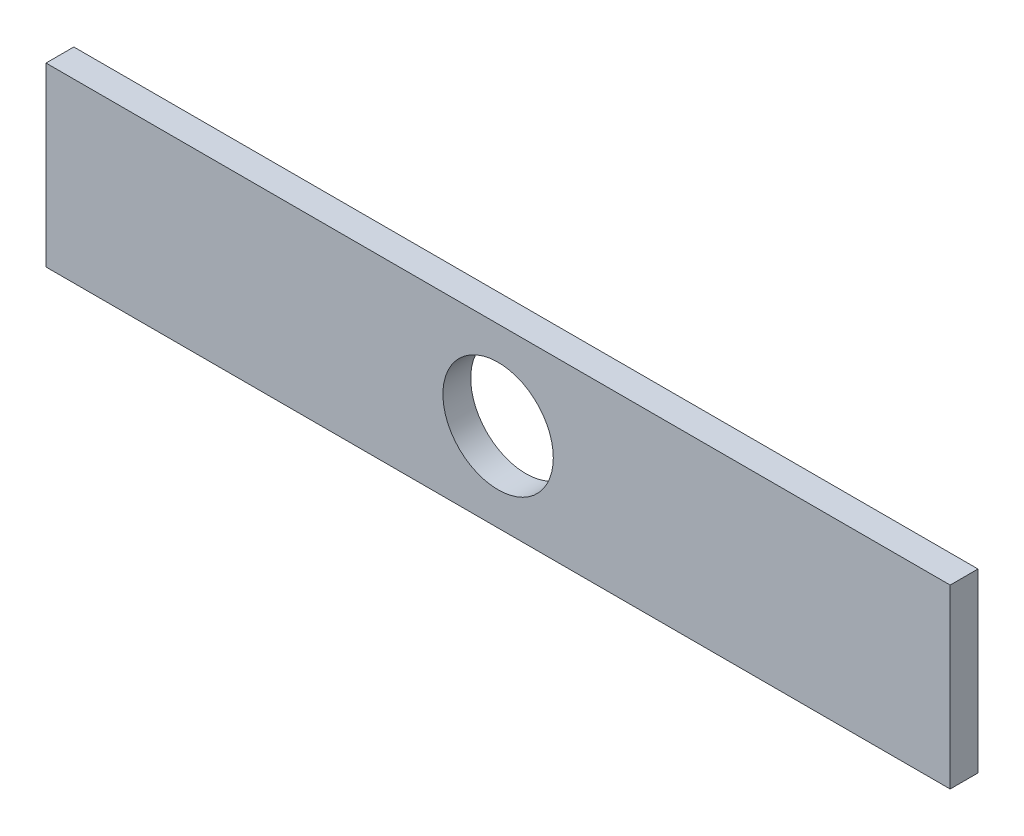
ISO-10303-21;
HEADER;
FILE_DESCRIPTION(('STEP AP214'),'2;1');
FILE_NAME('part.step','',(''),(''),'','','');
FILE_SCHEMA(('AUTOMOTIVE_DESIGN { 1 0 10303 214 1 1 1 1 }'));
ENDSEC;
DATA;
#1=APPLICATION_CONTEXT('core data for automotive mechanical design processes');
#2=APPLICATION_PROTOCOL_DEFINITION('international standard','automotive_design',2000,#1);
#3=PRODUCT_CONTEXT('',#1,'mechanical');
#4=PRODUCT('Part','Part','',(#3));
#5=PRODUCT_RELATED_PRODUCT_CATEGORY('part','',(#4));
#6=PRODUCT_DEFINITION_FORMATION('','',#4);
#7=PRODUCT_DEFINITION_CONTEXT('part definition',#1,'design');
#8=PRODUCT_DEFINITION('design','',#6,#7);
#9=PRODUCT_DEFINITION_SHAPE('','',#8);
#10=(LENGTH_UNIT() NAMED_UNIT(*) SI_UNIT(.MILLI.,.METRE.));
#11=(NAMED_UNIT(*) PLANE_ANGLE_UNIT() SI_UNIT($,.RADIAN.));
#12=(NAMED_UNIT(*) SI_UNIT($,.STERADIAN.) SOLID_ANGLE_UNIT());
#13=UNCERTAINTY_MEASURE_WITH_UNIT(LENGTH_MEASURE(1.E-05),#10,'distance_accuracy_value','');
#14=(GEOMETRIC_REPRESENTATION_CONTEXT(3) GLOBAL_UNCERTAINTY_ASSIGNED_CONTEXT((#13)) GLOBAL_UNIT_ASSIGNED_CONTEXT((#10,
#11,#12)) REPRESENTATION_CONTEXT('',''));
#15=CARTESIAN_POINT('',(0.,0.,0.));
#16=DIRECTION('',(0.,0.,1.));
#17=DIRECTION('',(1.,0.,0.));
#18=AXIS2_PLACEMENT_3D('',#15,#16,#17);
#19=CARTESIAN_POINT('',(0.,0.,4.));
#20=DIRECTION('',(0.,0.,1.));
#21=DIRECTION('',(1.,0.,0.));
#22=AXIS2_PLACEMENT_3D('',#19,#20,#21);
#23=PLANE('',#22);
#24=DIRECTION('',(0.,-1.,0.));
#25=VECTOR('',#24,1.);
#26=CARTESIAN_POINT('',(-65.,-12.7,4.));
#27=LINE('',#26,#25);
#28=CARTESIAN_POINT('',(-65.,12.7,4.));
#29=VERTEX_POINT('',#28);
#30=CARTESIAN_POINT('',(-65.,-12.7,4.));
#31=VERTEX_POINT('',#30);
#32=EDGE_CURVE('E85',#29,#31,#27,.T.);
#33=ORIENTED_EDGE('',*,*,#32,.T.);
#34=DIRECTION('',(1.,0.,0.));
#35=VECTOR('',#34,1.);
#36=CARTESIAN_POINT('',(65.,-12.7,4.));
#37=LINE('',#36,#35);
#38=CARTESIAN_POINT('',(65.,-12.7,4.));
#39=VERTEX_POINT('',#38);
#40=EDGE_CURVE('E80',#31,#39,#37,.T.);
#41=ORIENTED_EDGE('',*,*,#40,.T.);
#42=DIRECTION('',(0.,1.,0.));
#43=VECTOR('',#42,1.);
#44=CARTESIAN_POINT('',(65.,-12.7,4.));
#45=LINE('',#44,#43);
#46=CARTESIAN_POINT('',(65.,12.7,4.));
#47=VERTEX_POINT('',#46);
#48=EDGE_CURVE('E83',#39,#47,#45,.T.);
#49=ORIENTED_EDGE('',*,*,#48,.T.);
#50=DIRECTION('',(-1.,0.,0.));
#51=VECTOR('',#50,1.);
#52=CARTESIAN_POINT('',(65.,12.7,4.));
#53=LINE('',#52,#51);
#54=EDGE_CURVE('E50',#47,#29,#53,.T.);
#55=ORIENTED_EDGE('',*,*,#54,.T.);
#56=EDGE_LOOP('',(#33,#41,#49,#55));
#57=FACE_BOUND('',#56,.T.);
#58=CARTESIAN_POINT('',(0.,0.,4.));
#59=DIRECTION('',(0.,0.,1.));
#60=DIRECTION('',(1.,0.,0.));
#61=AXIS2_PLACEMENT_3D('',#58,#59,#60);
#62=CIRCLE('',#61,7.9375);
#63=CARTESIAN_POINT('',(7.9375,0.,4.));
#64=VERTEX_POINT('',#63);
#65=EDGE_CURVE('E100',#64,#64,#62,.T.);
#66=ORIENTED_EDGE('',*,*,#65,.F.);
#67=EDGE_LOOP('',(#66));
#68=FACE_BOUND('',#67,.T.);
#69=ADVANCED_FACE('F33',(#57,#68),#23,.T.);
#70=CARTESIAN_POINT('',(0.,0.,0.));
#71=DIRECTION('',(0.,0.,1.));
#72=DIRECTION('',(1.,0.,0.));
#73=AXIS2_PLACEMENT_3D('',#70,#71,#72);
#74=PLANE('',#73);
#75=DIRECTION('',(0.,-1.,0.));
#76=VECTOR('',#75,1.);
#77=CARTESIAN_POINT('',(-65.,-12.7,0.));
#78=LINE('',#77,#76);
#79=CARTESIAN_POINT('',(-65.,12.7,0.));
#80=VERTEX_POINT('',#79);
#81=CARTESIAN_POINT('',(-65.,-12.7,0.));
#82=VERTEX_POINT('',#81);
#83=EDGE_CURVE('E97',#80,#82,#78,.T.);
#84=ORIENTED_EDGE('',*,*,#83,.F.);
#85=DIRECTION('',(-1.,0.,0.));
#86=VECTOR('',#85,1.);
#87=CARTESIAN_POINT('',(65.,12.7,0.));
#88=LINE('',#87,#86);
#89=CARTESIAN_POINT('',(65.,12.7,0.));
#90=VERTEX_POINT('',#89);
#91=EDGE_CURVE('E73',#90,#80,#88,.T.);
#92=ORIENTED_EDGE('',*,*,#91,.F.);
#93=DIRECTION('',(0.,1.,0.));
#94=VECTOR('',#93,1.);
#95=CARTESIAN_POINT('',(65.,-12.7,0.));
#96=LINE('',#95,#94);
#97=CARTESIAN_POINT('',(65.,-12.7,0.));
#98=VERTEX_POINT('',#97);
#99=EDGE_CURVE('E67',#98,#90,#96,.T.);
#100=ORIENTED_EDGE('',*,*,#99,.F.);
#101=DIRECTION('',(1.,0.,0.));
#102=VECTOR('',#101,1.);
#103=CARTESIAN_POINT('',(65.,-12.7,0.));
#104=LINE('',#103,#102);
#105=EDGE_CURVE('E89',#82,#98,#104,.T.);
#106=ORIENTED_EDGE('',*,*,#105,.F.);
#107=EDGE_LOOP('',(#84,#92,#100,#106));
#108=FACE_BOUND('',#107,.T.);
#109=CARTESIAN_POINT('',(0.,0.,0.));
#110=DIRECTION('',(0.,0.,1.));
#111=DIRECTION('',(1.,0.,0.));
#112=AXIS2_PLACEMENT_3D('',#109,#110,#111);
#113=CIRCLE('',#112,7.9375);
#114=CARTESIAN_POINT('',(7.9375,0.,0.));
#115=VERTEX_POINT('',#114);
#116=EDGE_CURVE('E112',#115,#115,#113,.T.);
#117=ORIENTED_EDGE('',*,*,#116,.T.);
#118=EDGE_LOOP('',(#117));
#119=FACE_BOUND('',#118,.T.);
#120=ADVANCED_FACE('F108',(#108,#119),#74,.F.);
#121=CARTESIAN_POINT('',(-65.,-12.7,4.));
#122=DIRECTION('',(1.,0.,0.));
#123=DIRECTION('',(0.,0.,-1.));
#124=AXIS2_PLACEMENT_3D('',#121,#122,#123);
#125=PLANE('',#124);
#126=ORIENTED_EDGE('',*,*,#83,.T.);
#127=DIRECTION('',(0.,0.,-1.));
#128=VECTOR('',#127,1.);
#129=CARTESIAN_POINT('',(-65.,-12.7,4.));
#130=LINE('',#129,#128);
#131=EDGE_CURVE('E11',#31,#82,#130,.T.);
#132=ORIENTED_EDGE('',*,*,#131,.F.);
#133=ORIENTED_EDGE('',*,*,#32,.F.);
#134=DIRECTION('',(0.,0.,-1.));
#135=VECTOR('',#134,1.);
#136=CARTESIAN_POINT('',(-65.,12.7,4.));
#137=LINE('',#136,#135);
#138=EDGE_CURVE('E93',#29,#80,#137,.T.);
#139=ORIENTED_EDGE('',*,*,#138,.T.);
#140=EDGE_LOOP('',(#126,#132,#133,#139));
#141=FACE_BOUND('',#140,.T.);
#142=ADVANCED_FACE('F35',(#141),#125,.F.);
#143=CARTESIAN_POINT('',(65.,-12.7,4.));
#144=DIRECTION('',(0.,1.,0.));
#145=DIRECTION('',(-1.,0.,0.));
#146=AXIS2_PLACEMENT_3D('',#143,#144,#145);
#147=PLANE('',#146);
#148=ORIENTED_EDGE('',*,*,#105,.T.);
#149=DIRECTION('',(0.,0.,-1.));
#150=VECTOR('',#149,1.);
#151=CARTESIAN_POINT('',(65.,-12.7,4.));
#152=LINE('',#151,#150);
#153=EDGE_CURVE('E42',#39,#98,#152,.T.);
#154=ORIENTED_EDGE('',*,*,#153,.F.);
#155=ORIENTED_EDGE('',*,*,#40,.F.);
#156=ORIENTED_EDGE('',*,*,#131,.T.);
#157=EDGE_LOOP('',(#148,#154,#155,#156));
#158=FACE_BOUND('',#157,.T.);
#159=ADVANCED_FACE('F88',(#158),#147,.F.);
#160=CARTESIAN_POINT('',(65.,-12.7,4.));
#161=DIRECTION('',(-1.,0.,0.));
#162=DIRECTION('',(0.,0.,1.));
#163=AXIS2_PLACEMENT_3D('',#160,#161,#162);
#164=PLANE('',#163);
#165=ORIENTED_EDGE('',*,*,#99,.T.);
#166=DIRECTION('',(0.,0.,-1.));
#167=VECTOR('',#166,1.);
#168=CARTESIAN_POINT('',(65.,12.7,4.));
#169=LINE('',#168,#167);
#170=EDGE_CURVE('E90',#47,#90,#169,.T.);
#171=ORIENTED_EDGE('',*,*,#170,.F.);
#172=ORIENTED_EDGE('',*,*,#48,.F.);
#173=ORIENTED_EDGE('',*,*,#153,.T.);
#174=EDGE_LOOP('',(#165,#171,#172,#173));
#175=FACE_BOUND('',#174,.T.);
#176=ADVANCED_FACE('F91',(#175),#164,.F.);
#177=CARTESIAN_POINT('',(65.,12.7,4.));
#178=DIRECTION('',(0.,-1.,0.));
#179=DIRECTION('',(1.,0.,0.));
#180=AXIS2_PLACEMENT_3D('',#177,#178,#179);
#181=PLANE('',#180);
#182=ORIENTED_EDGE('',*,*,#91,.T.);
#183=ORIENTED_EDGE('',*,*,#138,.F.);
#184=ORIENTED_EDGE('',*,*,#54,.F.);
#185=ORIENTED_EDGE('',*,*,#170,.T.);
#186=EDGE_LOOP('',(#182,#183,#184,#185));
#187=FACE_BOUND('',#186,.T.);
#188=ADVANCED_FACE('F105',(#187),#181,.F.);
#189=CARTESIAN_POINT('',(0.,0.,4.));
#190=DIRECTION('',(0.,0.,-1.));
#191=DIRECTION('',(-1.,0.,0.));
#192=AXIS2_PLACEMENT_3D('',#189,#190,#191);
#193=CYLINDRICAL_SURFACE('',#192,7.9375);
#194=ORIENTED_EDGE('',*,*,#65,.T.);
#195=EDGE_LOOP('',(#194));
#196=FACE_BOUND('',#195,.T.);
#197=ORIENTED_EDGE('',*,*,#116,.F.);
#198=EDGE_LOOP('',(#197));
#199=FACE_BOUND('',#198,.T.);
#200=ADVANCED_FACE('F118',(#196,#199),#193,.F.);
#201=CLOSED_SHELL('',(#69,#120,#142,#159,#176,#188,#200));
#202=MANIFOLD_SOLID_BREP('B2',#201);
#203=ADVANCED_BREP_SHAPE_REPRESENTATION('',(#18,#202),#14);
#204=SHAPE_DEFINITION_REPRESENTATION(#9,#203);
ENDSEC;
END-ISO-10303-21;
